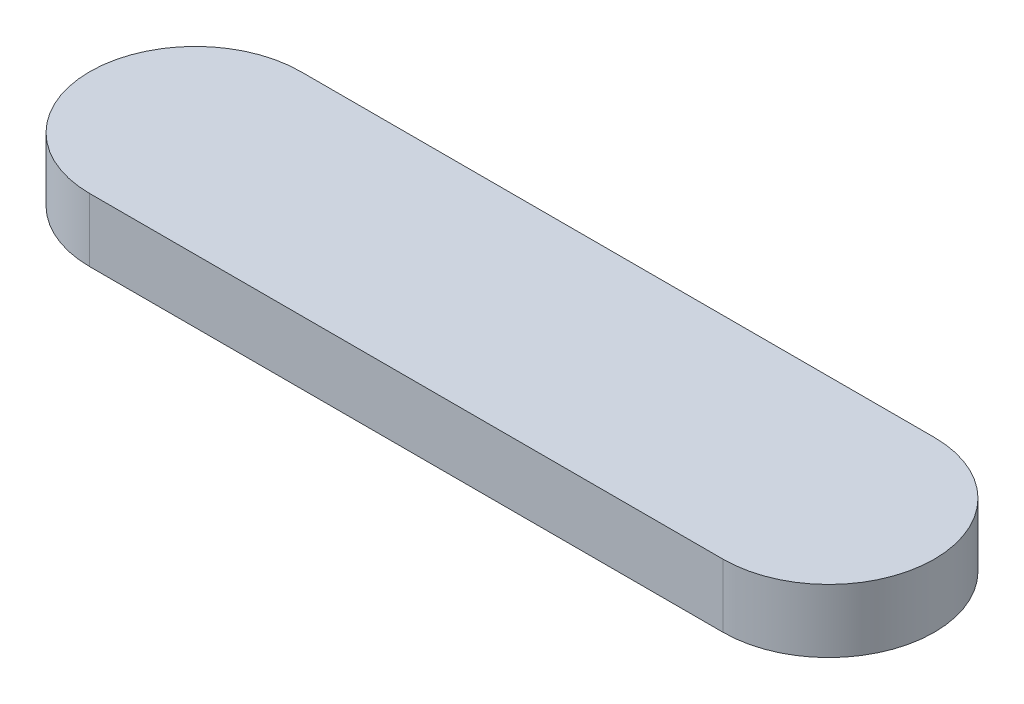
ISO-10303-21;
HEADER;
FILE_DESCRIPTION(('STEP AP214'),'2;1');
FILE_NAME('part.step','',(''),(''),'','','');
FILE_SCHEMA(('AUTOMOTIVE_DESIGN { 1 0 10303 214 1 1 1 1 }'));
ENDSEC;
DATA;
#1=APPLICATION_CONTEXT('core data for automotive mechanical design processes');
#2=APPLICATION_PROTOCOL_DEFINITION('international standard','automotive_design',2000,#1);
#3=PRODUCT_CONTEXT('',#1,'mechanical');
#4=PRODUCT('Part','Part','',(#3));
#5=PRODUCT_RELATED_PRODUCT_CATEGORY('part','',(#4));
#6=PRODUCT_DEFINITION_FORMATION('','',#4);
#7=PRODUCT_DEFINITION_CONTEXT('part definition',#1,'design');
#8=PRODUCT_DEFINITION('design','',#6,#7);
#9=PRODUCT_DEFINITION_SHAPE('','',#8);
#10=(LENGTH_UNIT() NAMED_UNIT(*) SI_UNIT(.MILLI.,.METRE.));
#11=(NAMED_UNIT(*) PLANE_ANGLE_UNIT() SI_UNIT($,.RADIAN.));
#12=(NAMED_UNIT(*) SI_UNIT($,.STERADIAN.) SOLID_ANGLE_UNIT());
#13=UNCERTAINTY_MEASURE_WITH_UNIT(LENGTH_MEASURE(1.E-05),#10,'distance_accuracy_value','');
#14=(GEOMETRIC_REPRESENTATION_CONTEXT(3) GLOBAL_UNCERTAINTY_ASSIGNED_CONTEXT((#13)) GLOBAL_UNIT_ASSIGNED_CONTEXT((#10,
#11,#12)) REPRESENTATION_CONTEXT('',''));
#15=CARTESIAN_POINT('',(0.,0.,0.));
#16=DIRECTION('',(0.,0.,1.));
#17=DIRECTION('',(1.,0.,0.));
#18=AXIS2_PLACEMENT_3D('',#15,#16,#17);
#19=CARTESIAN_POINT('',(0.,3.,0.));
#20=DIRECTION('',(0.,-1.,0.));
#21=DIRECTION('',(0.,0.,-1.));
#22=AXIS2_PLACEMENT_3D('',#19,#20,#21);
#23=CYLINDRICAL_SURFACE('',#22,5.);
#24=CARTESIAN_POINT('',(0.,0.,0.));
#25=DIRECTION('',(0.,1.,0.));
#26=DIRECTION('',(0.,0.,1.));
#27=AXIS2_PLACEMENT_3D('',#24,#25,#26);
#28=CIRCLE('',#27,5.);
#29=CARTESIAN_POINT('',(0.,0.,-5.));
#30=VERTEX_POINT('',#29);
#31=CARTESIAN_POINT('',(0.,0.,5.));
#32=VERTEX_POINT('',#31);
#33=EDGE_CURVE('E107',#30,#32,#28,.T.);
#34=ORIENTED_EDGE('',*,*,#33,.T.);
#35=DIRECTION('',(0.,-1.,0.));
#36=VECTOR('',#35,1.);
#37=CARTESIAN_POINT('',(0.,3.,5.));
#38=LINE('',#37,#36);
#39=CARTESIAN_POINT('',(0.,3.,5.));
#40=VERTEX_POINT('',#39);
#41=EDGE_CURVE('E11',#40,#32,#38,.T.);
#42=ORIENTED_EDGE('',*,*,#41,.F.);
#43=CARTESIAN_POINT('',(0.,3.,0.));
#44=DIRECTION('',(0.,1.,0.));
#45=DIRECTION('',(0.,0.,1.));
#46=AXIS2_PLACEMENT_3D('',#43,#44,#45);
#47=CIRCLE('',#46,5.);
#48=CARTESIAN_POINT('',(0.,3.,-5.));
#49=VERTEX_POINT('',#48);
#50=EDGE_CURVE('E91',#49,#40,#47,.T.);
#51=ORIENTED_EDGE('',*,*,#50,.F.);
#52=DIRECTION('',(0.,-1.,0.));
#53=VECTOR('',#52,1.);
#54=CARTESIAN_POINT('',(0.,3.,-5.));
#55=LINE('',#54,#53);
#56=EDGE_CURVE('E103',#49,#30,#55,.T.);
#57=ORIENTED_EDGE('',*,*,#56,.T.);
#58=EDGE_LOOP('',(#34,#42,#51,#57));
#59=FACE_BOUND('',#58,.T.);
#60=ADVANCED_FACE('F39',(#59),#23,.T.);
#61=CARTESIAN_POINT('',(0.,3.,5.));
#62=DIRECTION('',(0.,0.,-1.));
#63=DIRECTION('',(-1.,0.,0.));
#64=AXIS2_PLACEMENT_3D('',#61,#62,#63);
#65=PLANE('',#64);
#66=DIRECTION('',(1.,0.,0.));
#67=VECTOR('',#66,1.);
#68=CARTESIAN_POINT('',(0.,0.,5.));
#69=LINE('',#68,#67);
#70=CARTESIAN_POINT('',(30.,0.,5.));
#71=VERTEX_POINT('',#70);
#72=EDGE_CURVE('E96',#32,#71,#69,.T.);
#73=ORIENTED_EDGE('',*,*,#72,.T.);
#74=DIRECTION('',(0.,-1.,0.));
#75=VECTOR('',#74,1.);
#76=CARTESIAN_POINT('',(30.,3.,5.));
#77=LINE('',#76,#75);
#78=CARTESIAN_POINT('',(30.,3.,5.));
#79=VERTEX_POINT('',#78);
#80=EDGE_CURVE('E48',#79,#71,#77,.T.);
#81=ORIENTED_EDGE('',*,*,#80,.F.);
#82=DIRECTION('',(1.,0.,0.));
#83=VECTOR('',#82,1.);
#84=CARTESIAN_POINT('',(0.,3.,5.));
#85=LINE('',#84,#83);
#86=EDGE_CURVE('E86',#40,#79,#85,.T.);
#87=ORIENTED_EDGE('',*,*,#86,.F.);
#88=ORIENTED_EDGE('',*,*,#41,.T.);
#89=EDGE_LOOP('',(#73,#81,#87,#88));
#90=FACE_BOUND('',#89,.T.);
#91=ADVANCED_FACE('F95',(#90),#65,.F.);
#92=CARTESIAN_POINT('',(30.,3.,0.));
#93=DIRECTION('',(0.,-1.,0.));
#94=DIRECTION('',(0.,0.,-1.));
#95=AXIS2_PLACEMENT_3D('',#92,#93,#94);
#96=CYLINDRICAL_SURFACE('',#95,5.);
#97=CARTESIAN_POINT('',(30.,0.,0.));
#98=DIRECTION('',(0.,1.,0.));
#99=DIRECTION('',(0.,0.,1.));
#100=AXIS2_PLACEMENT_3D('',#97,#98,#99);
#101=CIRCLE('',#100,5.);
#102=CARTESIAN_POINT('',(30.,0.,-5.));
#103=VERTEX_POINT('',#102);
#104=EDGE_CURVE('E73',#71,#103,#101,.T.);
#105=ORIENTED_EDGE('',*,*,#104,.T.);
#106=DIRECTION('',(0.,-1.,0.));
#107=VECTOR('',#106,1.);
#108=CARTESIAN_POINT('',(30.,3.,-5.));
#109=LINE('',#108,#107);
#110=CARTESIAN_POINT('',(30.,3.,-5.));
#111=VERTEX_POINT('',#110);
#112=EDGE_CURVE('E98',#111,#103,#109,.T.);
#113=ORIENTED_EDGE('',*,*,#112,.F.);
#114=CARTESIAN_POINT('',(30.,3.,0.));
#115=DIRECTION('',(0.,1.,0.));
#116=DIRECTION('',(0.,0.,1.));
#117=AXIS2_PLACEMENT_3D('',#114,#115,#116);
#118=CIRCLE('',#117,5.);
#119=EDGE_CURVE('E89',#79,#111,#118,.T.);
#120=ORIENTED_EDGE('',*,*,#119,.F.);
#121=ORIENTED_EDGE('',*,*,#80,.T.);
#122=EDGE_LOOP('',(#105,#113,#120,#121));
#123=FACE_BOUND('',#122,.T.);
#124=ADVANCED_FACE('F99',(#123),#96,.T.);
#125=CARTESIAN_POINT('',(0.,3.,-5.));
#126=DIRECTION('',(0.,0.,1.));
#127=DIRECTION('',(1.,0.,0.));
#128=AXIS2_PLACEMENT_3D('',#125,#126,#127);
#129=PLANE('',#128);
#130=DIRECTION('',(-1.,0.,0.));
#131=VECTOR('',#130,1.);
#132=CARTESIAN_POINT('',(0.,0.,-5.));
#133=LINE('',#132,#131);
#134=EDGE_CURVE('E79',#103,#30,#133,.T.);
#135=ORIENTED_EDGE('',*,*,#134,.T.);
#136=ORIENTED_EDGE('',*,*,#56,.F.);
#137=DIRECTION('',(-1.,0.,0.));
#138=VECTOR('',#137,1.);
#139=CARTESIAN_POINT('',(0.,3.,-5.));
#140=LINE('',#139,#138);
#141=EDGE_CURVE('E56',#111,#49,#140,.T.);
#142=ORIENTED_EDGE('',*,*,#141,.F.);
#143=ORIENTED_EDGE('',*,*,#112,.T.);
#144=EDGE_LOOP('',(#135,#136,#142,#143));
#145=FACE_BOUND('',#144,.T.);
#146=ADVANCED_FACE('F120',(#145),#129,.F.);
#147=CARTESIAN_POINT('',(0.,3.,0.));
#148=DIRECTION('',(0.,1.,0.));
#149=DIRECTION('',(0.,0.,1.));
#150=AXIS2_PLACEMENT_3D('',#147,#148,#149);
#151=PLANE('',#150);
#152=ORIENTED_EDGE('',*,*,#50,.T.);
#153=ORIENTED_EDGE('',*,*,#86,.T.);
#154=ORIENTED_EDGE('',*,*,#119,.T.);
#155=ORIENTED_EDGE('',*,*,#141,.T.);
#156=EDGE_LOOP('',(#152,#153,#154,#155));
#157=FACE_BOUND('',#156,.T.);
#158=ADVANCED_FACE('F87',(#157),#151,.T.);
#159=CARTESIAN_POINT('',(0.,0.,0.));
#160=DIRECTION('',(0.,1.,0.));
#161=DIRECTION('',(0.,0.,1.));
#162=AXIS2_PLACEMENT_3D('',#159,#160,#161);
#163=PLANE('',#162);
#164=ORIENTED_EDGE('',*,*,#33,.F.);
#165=ORIENTED_EDGE('',*,*,#134,.F.);
#166=ORIENTED_EDGE('',*,*,#104,.F.);
#167=ORIENTED_EDGE('',*,*,#72,.F.);
#168=EDGE_LOOP('',(#164,#165,#166,#167));
#169=FACE_BOUND('',#168,.T.);
#170=ADVANCED_FACE('F123',(#169),#163,.F.);
#171=CLOSED_SHELL('',(#60,#91,#124,#146,#158,#170));
#172=MANIFOLD_SOLID_BREP('B2',#171);
#173=ADVANCED_BREP_SHAPE_REPRESENTATION('',(#18,#172),#14);
#174=SHAPE_DEFINITION_REPRESENTATION(#9,#173);
ENDSEC;
END-ISO-10303-21;
